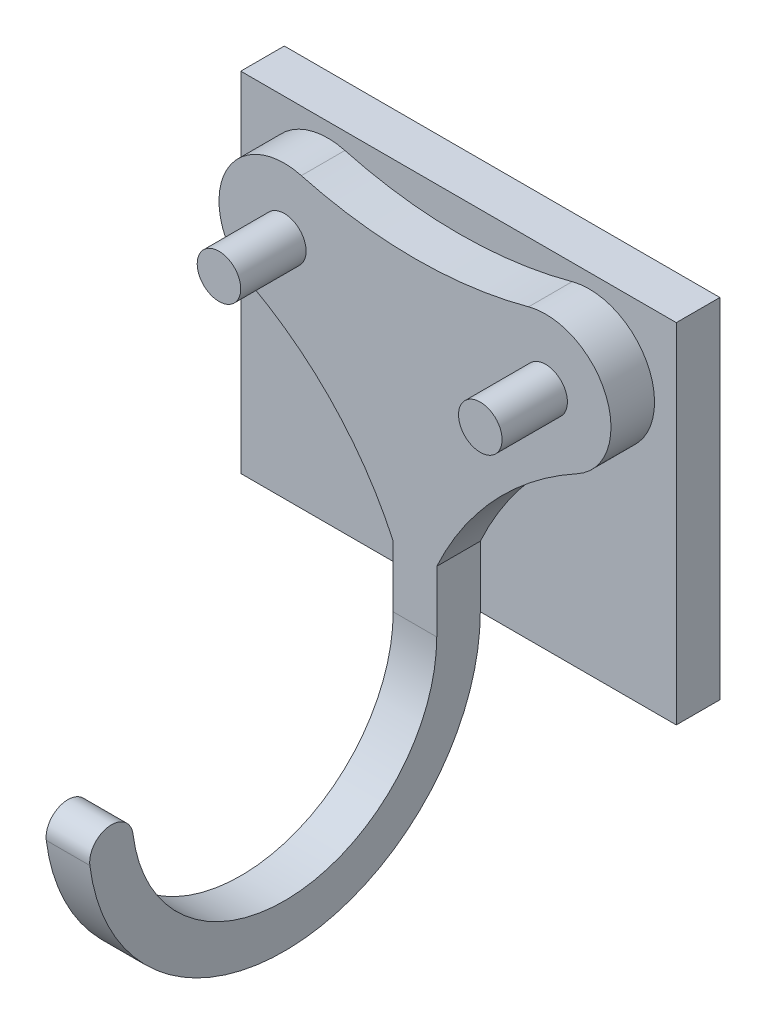
ISO-10303-21;
HEADER;
FILE_DESCRIPTION(('STEP AP214'),'2;1');
FILE_NAME('part.step','',(''),(''),'','','');
FILE_SCHEMA(('AUTOMOTIVE_DESIGN { 1 0 10303 214 1 1 1 1 }'));
ENDSEC;
DATA;
#1=APPLICATION_CONTEXT('core data for automotive mechanical design processes');
#2=APPLICATION_PROTOCOL_DEFINITION('international standard','automotive_design',2000,#1);
#3=PRODUCT_CONTEXT('',#1,'mechanical');
#4=PRODUCT('Part','Part','',(#3));
#5=PRODUCT_RELATED_PRODUCT_CATEGORY('part','',(#4));
#6=PRODUCT_DEFINITION_FORMATION('','',#4);
#7=PRODUCT_DEFINITION_CONTEXT('part definition',#1,'design');
#8=PRODUCT_DEFINITION('design','',#6,#7);
#9=PRODUCT_DEFINITION_SHAPE('','',#8);
#10=(LENGTH_UNIT() NAMED_UNIT(*) SI_UNIT(.MILLI.,.METRE.));
#11=(NAMED_UNIT(*) PLANE_ANGLE_UNIT() SI_UNIT($,.RADIAN.));
#12=(NAMED_UNIT(*) SI_UNIT($,.STERADIAN.) SOLID_ANGLE_UNIT());
#13=UNCERTAINTY_MEASURE_WITH_UNIT(LENGTH_MEASURE(1.E-05),#10,'distance_accuracy_value','');
#14=(GEOMETRIC_REPRESENTATION_CONTEXT(3) GLOBAL_UNCERTAINTY_ASSIGNED_CONTEXT((#13)) GLOBAL_UNIT_ASSIGNED_CONTEXT((#10,
#11,#12)) REPRESENTATION_CONTEXT('',''));
#15=CARTESIAN_POINT('',(0.,0.,0.));
#16=DIRECTION('',(0.,0.,1.));
#17=DIRECTION('',(1.,0.,0.));
#18=AXIS2_PLACEMENT_3D('',#15,#16,#17);
#19=CARTESIAN_POINT('',(1.2,-9.125,19.929410674843));
#20=CARTESIAN_POINT('',(1.13333333333327,-9.125,19.929410674843));
#21=CARTESIAN_POINT('',(1.06666666666676,-9.125,19.929410674843));
#22=CARTESIAN_POINT('',(0.33333333333245,-9.125,19.929410674843));
#23=CARTESIAN_POINT('',(-0.333333333333171,-9.125,19.929410674843));
#24=CARTESIAN_POINT('',(-1.06666666666668,-9.125,19.929410674843));
#25=CARTESIAN_POINT('',(-1.13333333333332,-9.125,19.929410674843));
#26=CARTESIAN_POINT('',(-1.2,-9.125,19.929410674843));
#27=CARTESIAN_POINT('',(1.2,-8.46356217223385,20.0127440081763));
#28=CARTESIAN_POINT('',(1.13333333333331,-8.46356217223385,20.0127440081763));
#29=CARTESIAN_POINT('',(1.0666666666667,-8.46356217223385,20.0127440081763));
#30=CARTESIAN_POINT('',(0.333333333333028,-8.46356217223385,20.0127440081763));
#31=CARTESIAN_POINT('',(-0.333333333333171,-8.46356217223385,20.0127440081763));
#32=CARTESIAN_POINT('',(-1.06666666666668,-8.46356217223385,20.0127440081763));
#33=CARTESIAN_POINT('',(-1.13333333333332,-8.46356217223385,20.0127440081763));
#34=CARTESIAN_POINT('',(-1.2,-8.46356217223385,20.0127440081763));
#35=CARTESIAN_POINT('',(1.2,-7.57426488752616,19.6208323040184));
#36=CARTESIAN_POINT('',(1.13333333333337,-7.57426488752616,19.6208323040184));
#37=CARTESIAN_POINT('',(1.06666666666662,-7.57426488752605,19.6208323040184));
#38=CARTESIAN_POINT('',(0.333333333333823,-7.57426488752732,19.6208323040184));
#39=CARTESIAN_POINT('',(-0.333333333333171,-7.57426488752616,19.6208323040184));
#40=CARTESIAN_POINT('',(-1.06666666666668,-7.57426488752616,19.6208323040184));
#41=CARTESIAN_POINT('',(-1.13333333333332,-7.57426488752616,19.6208323040184));
#42=CARTESIAN_POINT('',(-1.2,-7.57426488752616,19.6208323040184));
#43=CARTESIAN_POINT('',(1.2,-7.44926488752616,18.6286755623692));
#44=CARTESIAN_POINT('',(1.13333333333338,-7.44926488752616,18.6286755623692));
#45=CARTESIAN_POINT('',(1.06666666666661,-7.44926488752605,18.6286755623692));
#46=CARTESIAN_POINT('',(0.333333333333895,-7.44926488752732,18.6286755623692));
#47=CARTESIAN_POINT('',(-0.333333333333171,-7.44926488752616,18.6286755623692));
#48=CARTESIAN_POINT('',(-1.06666666666668,-7.44926488752616,18.6286755623692));
#49=CARTESIAN_POINT('',(-1.13333333333332,-7.44926488752616,18.6286755623692));
#50=CARTESIAN_POINT('',(-1.2,-7.44926488752616,18.6286755623692));
#51=CARTESIAN_POINT('',(1.2,-8.21356217223385,18.0284305248779));
#52=CARTESIAN_POINT('',(1.13333333333333,-8.21356217223385,18.0284305248779));
#53=CARTESIAN_POINT('',(1.06666666666668,-8.21356217223385,18.0284305248778));
#54=CARTESIAN_POINT('',(0.333333333333245,-8.21356217223385,18.028430524879));
#55=CARTESIAN_POINT('',(-0.333333333333171,-8.21356217223385,18.0284305248779));
#56=CARTESIAN_POINT('',(-1.06666666666668,-8.21356217223385,18.0284305248779));
#57=CARTESIAN_POINT('',(-1.13333333333332,-8.21356217223385,18.0284305248779));
#58=CARTESIAN_POINT('',(-1.2,-8.21356217223385,18.0284305248779));
#59=CARTESIAN_POINT('',(1.2,-8.875,17.9450971915445));
#60=CARTESIAN_POINT('',(1.13333333333328,-8.875,17.9450971915445));
#61=CARTESIAN_POINT('',(1.06666666666673,-8.875,17.9450971915445));
#62=CARTESIAN_POINT('',(0.333333333332666,-8.875,17.9450971915445));
#63=CARTESIAN_POINT('',(-0.333333333333171,-8.875,17.9450971915445));
#64=CARTESIAN_POINT('',(-1.06666666666668,-8.875,17.9450971915445));
#65=CARTESIAN_POINT('',(-1.13333333333332,-8.875,17.9450971915445));
#66=CARTESIAN_POINT('',(-1.2,-8.875,17.9450971915445));
#67=(BOUNDED_SURFACE() B_SPLINE_SURFACE(5,3,((#19,#20,#21,#22,#23,#24,#25,#26),(#27,#28,#29,#30,
#31,#32,#33,#34),(#35,#36,#37,#38,#39,#40,#41,#42),(#43,#44,#45,#46,#47,#48,#49,#50),(#51,#52,
#53,#54,#55,#56,#57,#58),(#59,#60,#61,#62,#63,#64,#65,#66)),.UNSPECIFIED.,.F.,.F.,
.F.) B_SPLINE_SURFACE_WITH_KNOTS((6,6),(4,2,2,4),(0.,1.),(-0.1,0.,1.,1.1),
.UNSPECIFIED.) GEOMETRIC_REPRESENTATION_ITEM() RATIONAL_B_SPLINE_SURFACE(((1.,1.,1.,1.,1.,1.,1.,
1.),(0.599999999999999,0.599999999999999,0.599999999999999,0.599999999999999,0.599999999999999,
0.599999999999999,0.599999999999999,0.599999999999999),(0.399999999999999,0.399999999999999,
0.399999999999999,0.399999999999999,0.399999999999999,0.399999999999999,0.399999999999999,
0.399999999999999),(0.399999999999999,0.399999999999999,0.399999999999999,0.399999999999999,
0.399999999999999,0.399999999999999,0.399999999999999,0.399999999999999),(0.599999999999999,
0.599999999999999,0.599999999999999,0.599999999999999,0.599999999999999,0.599999999999999,
0.599999999999999,0.599999999999999),(1.,1.,1.,1.,1.,1.,1.,1.))) REPRESENTATION_ITEM('') SURFACE());
#68=CARTESIAN_POINT('',(-1.2,-9.125,19.929410674843));
#69=CARTESIAN_POINT('',(-1.13333333333332,-9.125,19.929410674843));
#70=CARTESIAN_POINT('',(-1.06666666666668,-9.125,19.929410674843));
#71=CARTESIAN_POINT('',(-0.333333333333171,-9.125,19.929410674843));
#72=CARTESIAN_POINT('',(0.33333333333245,-9.125,19.929410674843));
#73=CARTESIAN_POINT('',(1.06666666666676,-9.125,19.929410674843));
#74=CARTESIAN_POINT('',(1.13333333333327,-9.125,19.929410674843));
#75=CARTESIAN_POINT('',(1.2,-9.125,19.929410674843));
#76=(BOUNDED_CURVE() B_SPLINE_CURVE(3,(#68,#69,#70,#71,#72,#73,#74,#75),.UNSPECIFIED.,.F.,
.F.) B_SPLINE_CURVE_WITH_KNOTS((4,2,2,4),(-0.1,0.,1.,1.1),
.UNSPECIFIED.) CURVE() GEOMETRIC_REPRESENTATION_ITEM() RATIONAL_B_SPLINE_CURVE((1.,1.,1.,1.,1.,
1.,1.,1.)) REPRESENTATION_ITEM(''));
#77=CARTESIAN_POINT('',(1.,-9.125,19.929410674843));
#78=VERTEX_POINT('',#77);
#79=CARTESIAN_POINT('',(-1.,-9.125,19.929410674843));
#80=VERTEX_POINT('',#79);
#81=EDGE_CURVE('E204',#78,#80,#76,.F.);
#82=CARTESIAN_POINT('',(1.,-9.125,19.929410674843));
#83=CARTESIAN_POINT('',(1.,-8.46356217223385,20.0127440081763));
#84=CARTESIAN_POINT('',(1.,-7.57426488752616,19.6208323040184));
#85=CARTESIAN_POINT('',(1.,-7.44926488752616,18.6286755623692));
#86=CARTESIAN_POINT('',(1.,-8.21356217223385,18.0284305248779));
#87=CARTESIAN_POINT('',(1.,-8.875,17.9450971915445));
#88=(BOUNDED_CURVE() B_SPLINE_CURVE(5,(#82,#83,#84,#85,#86,#87),.UNSPECIFIED.,.F.,
.F.) B_SPLINE_CURVE_WITH_KNOTS((6,6),(0.,1.),
.UNSPECIFIED.) CURVE() GEOMETRIC_REPRESENTATION_ITEM() RATIONAL_B_SPLINE_CURVE((1.,
0.599999999999999,0.399999999999999,0.399999999999999,0.599999999999999,1.)) REPRESENTATION_ITEM(''));
#89=CARTESIAN_POINT('',(1.,-8.875,17.9450971915445));
#90=VERTEX_POINT('',#89);
#91=EDGE_CURVE('E53',#90,#78,#88,.F.);
#92=CARTESIAN_POINT('',(1.2,-8.875,17.9450971915445));
#93=CARTESIAN_POINT('',(1.13333333333328,-8.875,17.9450971915445));
#94=CARTESIAN_POINT('',(1.06666666666673,-8.875,17.9450971915445));
#95=CARTESIAN_POINT('',(0.333333333332666,-8.875,17.9450971915445));
#96=CARTESIAN_POINT('',(-0.333333333333171,-8.875,17.9450971915445));
#97=CARTESIAN_POINT('',(-1.06666666666668,-8.875,17.9450971915445));
#98=CARTESIAN_POINT('',(-1.13333333333332,-8.875,17.9450971915445));
#99=CARTESIAN_POINT('',(-1.2,-8.875,17.9450971915445));
#100=(BOUNDED_CURVE() B_SPLINE_CURVE(3,(#92,#93,#94,#95,#96,#97,#98,#99),.UNSPECIFIED.,.F.,
.F.) B_SPLINE_CURVE_WITH_KNOTS((4,2,2,4),(-0.1,0.,1.,1.1),
.UNSPECIFIED.) CURVE() GEOMETRIC_REPRESENTATION_ITEM() RATIONAL_B_SPLINE_CURVE((1.,1.,1.,1.,1.,
1.,1.,1.)) REPRESENTATION_ITEM(''));
#101=CARTESIAN_POINT('',(-1.,-8.875,17.9450971915445));
#102=VERTEX_POINT('',#101);
#103=EDGE_CURVE('E362',#102,#90,#100,.F.);
#104=CARTESIAN_POINT('',(-1.,-8.875,17.9450971915445));
#105=CARTESIAN_POINT('',(-1.,-8.21356217223385,18.0284305248779));
#106=CARTESIAN_POINT('',(-1.,-7.44926488752616,18.6286755623692));
#107=CARTESIAN_POINT('',(-1.,-7.57426488752616,19.6208323040184));
#108=CARTESIAN_POINT('',(-1.,-8.46356217223385,20.0127440081763));
#109=CARTESIAN_POINT('',(-1.,-9.125,19.929410674843));
#110=(BOUNDED_CURVE() B_SPLINE_CURVE(5,(#104,#105,#106,#107,#108,#109),.UNSPECIFIED.,.F.,
.F.) B_SPLINE_CURVE_WITH_KNOTS((6,6),(0.,1.),
.UNSPECIFIED.) CURVE() GEOMETRIC_REPRESENTATION_ITEM() RATIONAL_B_SPLINE_CURVE((1.,
0.599999999999999,0.399999999999999,0.399999999999999,0.599999999999999,1.)) REPRESENTATION_ITEM(''));
#111=EDGE_CURVE('E62',#80,#102,#110,.F.);
#112=ORIENTED_EDGE('',*,*,#81,.F.);
#113=ORIENTED_EDGE('',*,*,#91,.F.);
#114=ORIENTED_EDGE('',*,*,#103,.F.);
#115=ORIENTED_EDGE('',*,*,#111,.F.);
#116=EDGE_LOOP('',(#112,#113,#114,#115));
#117=FACE_BOUND('',#116,.T.);
#118=ADVANCED_FACE('F35',(#117),#67,.T.);
#119=CARTESIAN_POINT('',(-10.,-8.,2.));
#120=DIRECTION('',(0.,1.,0.));
#121=DIRECTION('',(0.,0.,1.));
#122=AXIS2_PLACEMENT_3D('',#119,#120,#121);
#123=PLANE('',#122);
#124=DIRECTION('',(-1.,0.,0.));
#125=VECTOR('',#124,1.);
#126=CARTESIAN_POINT('',(1.,-8.,2.));
#127=LINE('',#126,#125);
#128=CARTESIAN_POINT('',(1.,-8.,2.));
#129=VERTEX_POINT('',#128);
#130=CARTESIAN_POINT('',(-1.,-8.,2.));
#131=VERTEX_POINT('',#130);
#132=EDGE_CURVE('E153',#129,#131,#127,.T.);
#133=ORIENTED_EDGE('',*,*,#132,.T.);
#134=DIRECTION('',(1.,0.,0.));
#135=VECTOR('',#134,1.);
#136=CARTESIAN_POINT('',(-10.,-8.,2.));
#137=LINE('',#136,#135);
#138=CARTESIAN_POINT('',(-10.,-8.,2.));
#139=VERTEX_POINT('',#138);
#140=EDGE_CURVE('E176',#139,#131,#137,.T.);
#141=ORIENTED_EDGE('',*,*,#140,.F.);
#142=DIRECTION('',(0.,0.,-1.));
#143=VECTOR('',#142,1.);
#144=CARTESIAN_POINT('',(-10.,-8.,2.));
#145=LINE('',#144,#143);
#146=CARTESIAN_POINT('',(-10.,-8.,0.));
#147=VERTEX_POINT('',#146);
#148=EDGE_CURVE('E195',#139,#147,#145,.T.);
#149=ORIENTED_EDGE('',*,*,#148,.T.);
#150=DIRECTION('',(1.,0.,0.));
#151=VECTOR('',#150,1.);
#152=CARTESIAN_POINT('',(-10.,-8.,0.));
#153=LINE('',#152,#151);
#154=CARTESIAN_POINT('',(10.,-8.,0.));
#155=VERTEX_POINT('',#154);
#156=EDGE_CURVE('E191',#147,#155,#153,.T.);
#157=ORIENTED_EDGE('',*,*,#156,.T.);
#158=DIRECTION('',(0.,0.,-1.));
#159=VECTOR('',#158,1.);
#160=CARTESIAN_POINT('',(10.,-8.,2.));
#161=LINE('',#160,#159);
#162=CARTESIAN_POINT('',(10.,-8.,2.));
#163=VERTEX_POINT('',#162);
#164=EDGE_CURVE('E174',#163,#155,#161,.T.);
#165=ORIENTED_EDGE('',*,*,#164,.F.);
#166=EDGE_CURVE('E167',#129,#163,#137,.T.);
#167=ORIENTED_EDGE('',*,*,#166,.F.);
#168=EDGE_LOOP('',(#133,#141,#149,#157,#165,#167));
#169=FACE_BOUND('',#168,.T.);
#170=ADVANCED_FACE('F172',(#169),#123,.F.);
#171=CARTESIAN_POINT('',(10.,8.,2.));
#172=DIRECTION('',(-1.,0.,0.));
#173=DIRECTION('',(0.,0.,1.));
#174=AXIS2_PLACEMENT_3D('',#171,#172,#173);
#175=PLANE('',#174);
#176=DIRECTION('',(0.,1.,0.));
#177=VECTOR('',#176,1.);
#178=CARTESIAN_POINT('',(10.,8.,0.));
#179=LINE('',#178,#177);
#180=CARTESIAN_POINT('',(10.,8.,0.));
#181=VERTEX_POINT('',#180);
#182=EDGE_CURVE('E183',#155,#181,#179,.T.);
#183=ORIENTED_EDGE('',*,*,#182,.T.);
#184=DIRECTION('',(0.,0.,-1.));
#185=VECTOR('',#184,1.);
#186=CARTESIAN_POINT('',(10.,8.,2.));
#187=LINE('',#186,#185);
#188=CARTESIAN_POINT('',(10.,8.,2.));
#189=VERTEX_POINT('',#188);
#190=EDGE_CURVE('E201',#189,#181,#187,.T.);
#191=ORIENTED_EDGE('',*,*,#190,.F.);
#192=DIRECTION('',(0.,1.,0.));
#193=VECTOR('',#192,1.);
#194=CARTESIAN_POINT('',(10.,8.,2.));
#195=LINE('',#194,#193);
#196=EDGE_CURVE('E193',#163,#189,#195,.T.);
#197=ORIENTED_EDGE('',*,*,#196,.F.);
#198=ORIENTED_EDGE('',*,*,#164,.T.);
#199=EDGE_LOOP('',(#183,#191,#197,#198));
#200=FACE_BOUND('',#199,.T.);
#201=ADVANCED_FACE('F434',(#200),#175,.F.);
#202=CARTESIAN_POINT('',(-10.,8.,2.));
#203=DIRECTION('',(0.,-1.,0.));
#204=DIRECTION('',(0.,0.,-1.));
#205=AXIS2_PLACEMENT_3D('',#202,#203,#204);
#206=PLANE('',#205);
#207=DIRECTION('',(-1.,0.,0.));
#208=VECTOR('',#207,1.);
#209=CARTESIAN_POINT('',(-10.,8.,0.));
#210=LINE('',#209,#208);
#211=CARTESIAN_POINT('',(-10.,8.,0.));
#212=VERTEX_POINT('',#211);
#213=EDGE_CURVE('E186',#181,#212,#210,.T.);
#214=ORIENTED_EDGE('',*,*,#213,.T.);
#215=DIRECTION('',(0.,0.,-1.));
#216=VECTOR('',#215,1.);
#217=CARTESIAN_POINT('',(-10.,8.,2.));
#218=LINE('',#217,#216);
#219=CARTESIAN_POINT('',(-10.,8.,2.));
#220=VERTEX_POINT('',#219);
#221=EDGE_CURVE('E198',#220,#212,#218,.T.);
#222=ORIENTED_EDGE('',*,*,#221,.F.);
#223=DIRECTION('',(-1.,0.,0.));
#224=VECTOR('',#223,1.);
#225=CARTESIAN_POINT('',(-10.,8.,2.));
#226=LINE('',#225,#224);
#227=EDGE_CURVE('E179',#189,#220,#226,.T.);
#228=ORIENTED_EDGE('',*,*,#227,.F.);
#229=ORIENTED_EDGE('',*,*,#190,.T.);
#230=EDGE_LOOP('',(#214,#222,#228,#229));
#231=FACE_BOUND('',#230,.T.);
#232=ADVANCED_FACE('F268',(#231),#206,.F.);
#233=CARTESIAN_POINT('',(-10.,8.,2.));
#234=DIRECTION('',(1.,0.,0.));
#235=DIRECTION('',(0.,0.,-1.));
#236=AXIS2_PLACEMENT_3D('',#233,#234,#235);
#237=PLANE('',#236);
#238=DIRECTION('',(0.,-1.,0.));
#239=VECTOR('',#238,1.);
#240=CARTESIAN_POINT('',(-10.,8.,0.));
#241=LINE('',#240,#239);
#242=EDGE_CURVE('E189',#212,#147,#241,.T.);
#243=ORIENTED_EDGE('',*,*,#242,.T.);
#244=ORIENTED_EDGE('',*,*,#148,.F.);
#245=DIRECTION('',(0.,-1.,0.));
#246=VECTOR('',#245,1.);
#247=CARTESIAN_POINT('',(-10.,8.,2.));
#248=LINE('',#247,#246);
#249=EDGE_CURVE('E177',#220,#139,#248,.T.);
#250=ORIENTED_EDGE('',*,*,#249,.F.);
#251=ORIENTED_EDGE('',*,*,#221,.T.);
#252=EDGE_LOOP('',(#243,#244,#250,#251));
#253=FACE_BOUND('',#252,.T.);
#254=ADVANCED_FACE('F271',(#253),#237,.F.);
#255=CARTESIAN_POINT('',(0.,0.,2.));
#256=DIRECTION('',(0.,0.,1.));
#257=DIRECTION('',(1.,0.,0.));
#258=AXIS2_PLACEMENT_3D('',#255,#256,#257);
#259=PLANE('',#258);
#260=DIRECTION('',(0.,-1.,0.));
#261=VECTOR('',#260,1.);
#262=CARTESIAN_POINT('',(-1.,-8.,2.));
#263=LINE('',#262,#261);
#264=CARTESIAN_POINT('',(-1.,-5.19120215029254,2.));
#265=VERTEX_POINT('',#264);
#266=EDGE_CURVE('E217',#265,#131,#263,.T.);
#267=ORIENTED_EDGE('',*,*,#266,.F.);
#268=CARTESIAN_POINT('',(-14.6287974311861,-11.4566534971387,2.));
#269=DIRECTION('',(0.,0.,-1.));
#270=DIRECTION('',(1.,0.,0.));
#271=AXIS2_PLACEMENT_3D('',#268,#269,#270);
#272=CIRCLE('',#271,15.);
#273=CARTESIAN_POINT('',(-7.43813290519768,1.7074774530871,2.));
#274=VERTEX_POINT('',#273);
#275=EDGE_CURVE('E243',#274,#265,#272,.T.);
#276=ORIENTED_EDGE('',*,*,#275,.F.);
#277=CARTESIAN_POINT('',(-6.,4.34030364313225,2.));
#278=DIRECTION('',(0.,0.,1.));
#279=DIRECTION('',(1.,0.,0.));
#280=AXIS2_PLACEMENT_3D('',#277,#278,#279);
#281=CIRCLE('',#280,3.);
#282=CARTESIAN_POINT('',(-5.21739130434783,7.23642581415502,2.));
#283=VERTEX_POINT('',#282);
#284=EDGE_CURVE('E240',#283,#274,#281,.T.);
#285=ORIENTED_EDGE('',*,*,#284,.F.);
#286=CARTESIAN_POINT('',(0.,26.5439069543068,2.));
#287=DIRECTION('',(0.,0.,-1.));
#288=DIRECTION('',(1.,0.,0.));
#289=AXIS2_PLACEMENT_3D('',#286,#287,#288);
#290=CIRCLE('',#289,20.);
#291=CARTESIAN_POINT('',(5.21739130434782,7.23642581415501,2.));
#292=VERTEX_POINT('',#291);
#293=EDGE_CURVE('E237',#292,#283,#290,.T.);
#294=ORIENTED_EDGE('',*,*,#293,.F.);
#295=CARTESIAN_POINT('',(6.,4.34030364313226,2.));
#296=DIRECTION('',(0.,0.,1.));
#297=DIRECTION('',(1.,0.,0.));
#298=AXIS2_PLACEMENT_3D('',#295,#296,#297);
#299=CIRCLE('',#298,3.);
#300=CARTESIAN_POINT('',(7.43813290519768,1.7074774530871,2.));
#301=VERTEX_POINT('',#300);
#302=EDGE_CURVE('E234',#301,#292,#299,.T.);
#303=ORIENTED_EDGE('',*,*,#302,.F.);
#304=CARTESIAN_POINT('',(14.6287974311861,-11.4566534971387,2.));
#305=DIRECTION('',(0.,0.,-1.));
#306=DIRECTION('',(-1.,0.,0.));
#307=AXIS2_PLACEMENT_3D('',#304,#305,#306);
#308=CIRCLE('',#307,15.);
#309=CARTESIAN_POINT('',(0.999999999999999,-5.19120215029254,2.));
#310=VERTEX_POINT('',#309);
#311=EDGE_CURVE('E170',#310,#301,#308,.T.);
#312=ORIENTED_EDGE('',*,*,#311,.F.);
#313=DIRECTION('',(0.,1.,0.));
#314=VECTOR('',#313,1.);
#315=CARTESIAN_POINT('',(1.,-8.,2.));
#316=LINE('',#315,#314);
#317=EDGE_CURVE('E148',#129,#310,#316,.T.);
#318=ORIENTED_EDGE('',*,*,#317,.F.);
#319=ORIENTED_EDGE('',*,*,#166,.T.);
#320=ORIENTED_EDGE('',*,*,#196,.T.);
#321=ORIENTED_EDGE('',*,*,#227,.T.);
#322=ORIENTED_EDGE('',*,*,#249,.T.);
#323=ORIENTED_EDGE('',*,*,#140,.T.);
#324=EDGE_LOOP('',(#267,#276,#285,#294,#303,#312,#318,#319,#320,#321,#322,#323));
#325=FACE_BOUND('',#324,.T.);
#326=ADVANCED_FACE('F165',(#325),#259,.T.);
#327=CARTESIAN_POINT('',(0.,0.,0.));
#328=DIRECTION('',(0.,0.,1.));
#329=DIRECTION('',(1.,0.,0.));
#330=AXIS2_PLACEMENT_3D('',#327,#328,#329);
#331=PLANE('',#330);
#332=ORIENTED_EDGE('',*,*,#182,.F.);
#333=ORIENTED_EDGE('',*,*,#156,.F.);
#334=ORIENTED_EDGE('',*,*,#242,.F.);
#335=ORIENTED_EDGE('',*,*,#213,.F.);
#336=EDGE_LOOP('',(#332,#333,#334,#335));
#337=FACE_BOUND('',#336,.T.);
#338=ADVANCED_FACE('F398',(#337),#331,.F.);
#339=CARTESIAN_POINT('',(1.,-8.,4.));
#340=DIRECTION('',(-1.,0.,0.));
#341=DIRECTION('',(0.,0.,1.));
#342=AXIS2_PLACEMENT_3D('',#339,#340,#341);
#343=PLANE('',#342);
#344=CARTESIAN_POINT('',(1.,-8.,11.));
#345=DIRECTION('',(-1.,0.,0.));
#346=DIRECTION('',(0.,0.,1.));
#347=AXIS2_PLACEMENT_3D('',#344,#345,#346);
#348=CIRCLE('',#347,7.);
#349=CARTESIAN_POINT('',(1.,-8.,4.));
#350=VERTEX_POINT('',#349);
#351=EDGE_CURVE('E154',#350,#90,#348,.T.);
#352=ORIENTED_EDGE('',*,*,#351,.T.);
#353=ORIENTED_EDGE('',*,*,#91,.T.);
#354=CARTESIAN_POINT('',(1.,-8.,11.));
#355=DIRECTION('',(1.,0.,0.));
#356=DIRECTION('',(0.,0.,1.));
#357=AXIS2_PLACEMENT_3D('',#354,#355,#356);
#358=CIRCLE('',#357,9.);
#359=EDGE_CURVE('E142',#78,#129,#358,.T.);
#360=ORIENTED_EDGE('',*,*,#359,.T.);
#361=ORIENTED_EDGE('',*,*,#317,.T.);
#362=DIRECTION('',(0.,0.,-1.));
#363=VECTOR('',#362,1.);
#364=CARTESIAN_POINT('',(0.999999999999999,-5.19120215029254,4.));
#365=LINE('',#364,#363);
#366=CARTESIAN_POINT('',(0.999999999999999,-5.19120215029254,4.));
#367=VERTEX_POINT('',#366);
#368=EDGE_CURVE('E187',#367,#310,#365,.T.);
#369=ORIENTED_EDGE('',*,*,#368,.F.);
#370=DIRECTION('',(0.,1.,0.));
#371=VECTOR('',#370,1.);
#372=CARTESIAN_POINT('',(1.,-8.,4.));
#373=LINE('',#372,#371);
#374=EDGE_CURVE('E216',#350,#367,#373,.T.);
#375=ORIENTED_EDGE('',*,*,#374,.F.);
#376=EDGE_LOOP('',(#352,#353,#360,#361,#369,#375));
#377=FACE_BOUND('',#376,.T.);
#378=ADVANCED_FACE('F145',(#377),#343,.F.);
#379=CARTESIAN_POINT('',(14.6287974311861,-11.4566534971387,4.));
#380=DIRECTION('',(0.,0.,-1.));
#381=DIRECTION('',(-1.,0.,0.));
#382=AXIS2_PLACEMENT_3D('',#379,#380,#381);
#383=CYLINDRICAL_SURFACE('',#382,15.);
#384=ORIENTED_EDGE('',*,*,#311,.T.);
#385=DIRECTION('',(0.,0.,-1.));
#386=VECTOR('',#385,1.);
#387=CARTESIAN_POINT('',(7.43813290519768,1.7074774530871,4.));
#388=LINE('',#387,#386);
#389=CARTESIAN_POINT('',(7.43813290519768,1.7074774530871,4.));
#390=VERTEX_POINT('',#389);
#391=EDGE_CURVE('E259',#390,#301,#388,.T.);
#392=ORIENTED_EDGE('',*,*,#391,.F.);
#393=CARTESIAN_POINT('',(14.6287974311861,-11.4566534971387,4.));
#394=DIRECTION('',(0.,0.,-1.));
#395=DIRECTION('',(-1.,0.,0.));
#396=AXIS2_PLACEMENT_3D('',#393,#394,#395);
#397=CIRCLE('',#396,15.);
#398=EDGE_CURVE('E219',#367,#390,#397,.T.);
#399=ORIENTED_EDGE('',*,*,#398,.F.);
#400=ORIENTED_EDGE('',*,*,#368,.T.);
#401=EDGE_LOOP('',(#384,#392,#399,#400));
#402=FACE_BOUND('',#401,.T.);
#403=ADVANCED_FACE('F294',(#402),#383,.F.);
#404=CARTESIAN_POINT('',(6.,4.34030364313226,4.));
#405=DIRECTION('',(0.,0.,-1.));
#406=DIRECTION('',(-1.,0.,0.));
#407=AXIS2_PLACEMENT_3D('',#404,#405,#406);
#408=CYLINDRICAL_SURFACE('',#407,3.);
#409=ORIENTED_EDGE('',*,*,#302,.T.);
#410=DIRECTION('',(0.,0.,-1.));
#411=VECTOR('',#410,1.);
#412=CARTESIAN_POINT('',(5.21739130434782,7.23642581415501,4.));
#413=LINE('',#412,#411);
#414=CARTESIAN_POINT('',(5.21739130434782,7.23642581415501,4.));
#415=VERTEX_POINT('',#414);
#416=EDGE_CURVE('E256',#415,#292,#413,.T.);
#417=ORIENTED_EDGE('',*,*,#416,.F.);
#418=CARTESIAN_POINT('',(6.,4.34030364313226,4.));
#419=DIRECTION('',(0.,0.,1.));
#420=DIRECTION('',(1.,0.,0.));
#421=AXIS2_PLACEMENT_3D('',#418,#419,#420);
#422=CIRCLE('',#421,3.);
#423=EDGE_CURVE('E221',#390,#415,#422,.T.);
#424=ORIENTED_EDGE('',*,*,#423,.F.);
#425=ORIENTED_EDGE('',*,*,#391,.T.);
#426=EDGE_LOOP('',(#409,#417,#424,#425));
#427=FACE_BOUND('',#426,.T.);
#428=ADVANCED_FACE('F289',(#427),#408,.T.);
#429=CARTESIAN_POINT('',(0.,26.5439069543068,4.));
#430=DIRECTION('',(0.,0.,-1.));
#431=DIRECTION('',(-1.,0.,0.));
#432=AXIS2_PLACEMENT_3D('',#429,#430,#431);
#433=CYLINDRICAL_SURFACE('',#432,20.);
#434=ORIENTED_EDGE('',*,*,#293,.T.);
#435=DIRECTION('',(0.,0.,-1.));
#436=VECTOR('',#435,1.);
#437=CARTESIAN_POINT('',(-5.21739130434783,7.23642581415502,4.));
#438=LINE('',#437,#436);
#439=CARTESIAN_POINT('',(-5.21739130434783,7.23642581415502,4.));
#440=VERTEX_POINT('',#439);
#441=EDGE_CURVE('E253',#440,#283,#438,.T.);
#442=ORIENTED_EDGE('',*,*,#441,.F.);
#443=CARTESIAN_POINT('',(0.,26.5439069543068,4.));
#444=DIRECTION('',(0.,0.,-1.));
#445=DIRECTION('',(1.,0.,0.));
#446=AXIS2_PLACEMENT_3D('',#443,#444,#445);
#447=CIRCLE('',#446,20.);
#448=EDGE_CURVE('E223',#415,#440,#447,.T.);
#449=ORIENTED_EDGE('',*,*,#448,.F.);
#450=ORIENTED_EDGE('',*,*,#416,.T.);
#451=EDGE_LOOP('',(#434,#442,#449,#450));
#452=FACE_BOUND('',#451,.T.);
#453=ADVANCED_FACE('F286',(#452),#433,.F.);
#454=CARTESIAN_POINT('',(-6.,4.34030364313225,4.));
#455=DIRECTION('',(0.,0.,-1.));
#456=DIRECTION('',(-1.,0.,0.));
#457=AXIS2_PLACEMENT_3D('',#454,#455,#456);
#458=CYLINDRICAL_SURFACE('',#457,3.);
#459=ORIENTED_EDGE('',*,*,#284,.T.);
#460=DIRECTION('',(0.,0.,-1.));
#461=VECTOR('',#460,1.);
#462=CARTESIAN_POINT('',(-7.43813290519768,1.7074774530871,4.));
#463=LINE('',#462,#461);
#464=CARTESIAN_POINT('',(-7.43813290519768,1.7074774530871,4.));
#465=VERTEX_POINT('',#464);
#466=EDGE_CURVE('E250',#465,#274,#463,.T.);
#467=ORIENTED_EDGE('',*,*,#466,.F.);
#468=CARTESIAN_POINT('',(-6.,4.34030364313225,4.));
#469=DIRECTION('',(0.,0.,1.));
#470=DIRECTION('',(1.,0.,0.));
#471=AXIS2_PLACEMENT_3D('',#468,#469,#470);
#472=CIRCLE('',#471,3.);
#473=EDGE_CURVE('E225',#440,#465,#472,.T.);
#474=ORIENTED_EDGE('',*,*,#473,.F.);
#475=ORIENTED_EDGE('',*,*,#441,.T.);
#476=EDGE_LOOP('',(#459,#467,#474,#475));
#477=FACE_BOUND('',#476,.T.);
#478=ADVANCED_FACE('F281',(#477),#458,.T.);
#479=CARTESIAN_POINT('',(-14.6287974311861,-11.4566534971387,4.));
#480=DIRECTION('',(0.,0.,-1.));
#481=DIRECTION('',(-1.,0.,0.));
#482=AXIS2_PLACEMENT_3D('',#479,#480,#481);
#483=CYLINDRICAL_SURFACE('',#482,15.);
#484=ORIENTED_EDGE('',*,*,#275,.T.);
#485=DIRECTION('',(0.,0.,-1.));
#486=VECTOR('',#485,1.);
#487=CARTESIAN_POINT('',(-1.,-5.19120215029254,4.));
#488=LINE('',#487,#486);
#489=CARTESIAN_POINT('',(-1.,-5.19120215029254,4.));
#490=VERTEX_POINT('',#489);
#491=EDGE_CURVE('E231',#490,#265,#488,.T.);
#492=ORIENTED_EDGE('',*,*,#491,.F.);
#493=CARTESIAN_POINT('',(-14.6287974311861,-11.4566534971387,4.));
#494=DIRECTION('',(0.,0.,-1.));
#495=DIRECTION('',(1.,0.,0.));
#496=AXIS2_PLACEMENT_3D('',#493,#494,#495);
#497=CIRCLE('',#496,15.);
#498=EDGE_CURVE('E227',#465,#490,#497,.T.);
#499=ORIENTED_EDGE('',*,*,#498,.F.);
#500=ORIENTED_EDGE('',*,*,#466,.T.);
#501=EDGE_LOOP('',(#484,#492,#499,#500));
#502=FACE_BOUND('',#501,.T.);
#503=ADVANCED_FACE('F278',(#502),#483,.F.);
#504=CARTESIAN_POINT('',(-1.,-8.,4.));
#505=DIRECTION('',(1.,0.,0.));
#506=DIRECTION('',(0.,0.,-1.));
#507=AXIS2_PLACEMENT_3D('',#504,#505,#506);
#508=PLANE('',#507);
#509=CARTESIAN_POINT('',(-1.,-8.,11.));
#510=DIRECTION('',(1.,0.,0.));
#511=DIRECTION('',(0.,0.,1.));
#512=AXIS2_PLACEMENT_3D('',#509,#510,#511);
#513=CIRCLE('',#512,9.);
#514=EDGE_CURVE('E158',#80,#131,#513,.T.);
#515=ORIENTED_EDGE('',*,*,#514,.F.);
#516=ORIENTED_EDGE('',*,*,#111,.T.);
#517=CARTESIAN_POINT('',(-1.,-8.,11.));
#518=DIRECTION('',(-1.,0.,0.));
#519=DIRECTION('',(0.,0.,1.));
#520=AXIS2_PLACEMENT_3D('',#517,#518,#519);
#521=CIRCLE('',#520,7.);
#522=CARTESIAN_POINT('',(-1.,-8.,4.));
#523=VERTEX_POINT('',#522);
#524=EDGE_CURVE('E206',#523,#102,#521,.T.);
#525=ORIENTED_EDGE('',*,*,#524,.F.);
#526=DIRECTION('',(0.,-1.,0.));
#527=VECTOR('',#526,1.);
#528=CARTESIAN_POINT('',(-1.,-8.,4.));
#529=LINE('',#528,#527);
#530=EDGE_CURVE('E229',#490,#523,#529,.T.);
#531=ORIENTED_EDGE('',*,*,#530,.F.);
#532=ORIENTED_EDGE('',*,*,#491,.T.);
#533=ORIENTED_EDGE('',*,*,#266,.T.);
#534=EDGE_LOOP('',(#515,#516,#525,#531,#532,#533));
#535=FACE_BOUND('',#534,.T.);
#536=ADVANCED_FACE('F273',(#535),#508,.F.);
#537=CARTESIAN_POINT('',(14.6287974311861,-11.4566534971387,4.));
#538=DIRECTION('',(0.,0.,-1.));
#539=DIRECTION('',(-1.,0.,0.));
#540=AXIS2_PLACEMENT_3D('',#537,#538,#539);
#541=PLANE('',#540);
#542=CARTESIAN_POINT('',(6.,4.34030364313226,4.));
#543=DIRECTION('',(0.,0.,-1.));
#544=DIRECTION('',(-1.,0.,0.));
#545=AXIS2_PLACEMENT_3D('',#542,#543,#544);
#546=CIRCLE('',#545,1.);
#547=CARTESIAN_POINT('',(5.,4.34030364313226,4.));
#548=VERTEX_POINT('',#547);
#549=EDGE_CURVE('E11',#548,#548,#546,.F.);
#550=ORIENTED_EDGE('',*,*,#549,.F.);
#551=EDGE_LOOP('',(#550));
#552=FACE_BOUND('',#551,.T.);
#553=CARTESIAN_POINT('',(-6.,4.34030364313225,4.));
#554=DIRECTION('',(0.,0.,-1.));
#555=DIRECTION('',(-1.,0.,0.));
#556=AXIS2_PLACEMENT_3D('',#553,#554,#555);
#557=CIRCLE('',#556,1.);
#558=CARTESIAN_POINT('',(-7.,4.34030364313225,4.));
#559=VERTEX_POINT('',#558);
#560=EDGE_CURVE('E46',#559,#559,#557,.F.);
#561=ORIENTED_EDGE('',*,*,#560,.F.);
#562=EDGE_LOOP('',(#561));
#563=FACE_BOUND('',#562,.T.);
#564=DIRECTION('',(1.,0.,0.));
#565=VECTOR('',#564,1.);
#566=CARTESIAN_POINT('',(-1.,-8.,4.));
#567=LINE('',#566,#565);
#568=EDGE_CURVE('E213',#523,#350,#567,.T.);
#569=ORIENTED_EDGE('',*,*,#568,.T.);
#570=ORIENTED_EDGE('',*,*,#374,.T.);
#571=ORIENTED_EDGE('',*,*,#398,.T.);
#572=ORIENTED_EDGE('',*,*,#423,.T.);
#573=ORIENTED_EDGE('',*,*,#448,.T.);
#574=ORIENTED_EDGE('',*,*,#473,.T.);
#575=ORIENTED_EDGE('',*,*,#498,.T.);
#576=ORIENTED_EDGE('',*,*,#530,.T.);
#577=EDGE_LOOP('',(#569,#570,#571,#572,#573,#574,#575,#576));
#578=FACE_BOUND('',#577,.T.);
#579=ADVANCED_FACE('F297',(#552,#563,#578),#541,.F.);
#580=CARTESIAN_POINT('',(1.,-8.,11.));
#581=DIRECTION('',(-1.,0.,0.));
#582=DIRECTION('',(0.,0.,1.));
#583=AXIS2_PLACEMENT_3D('',#580,#581,#582);
#584=CYLINDRICAL_SURFACE('',#583,7.);
#585=ORIENTED_EDGE('',*,*,#524,.T.);
#586=ORIENTED_EDGE('',*,*,#103,.T.);
#587=ORIENTED_EDGE('',*,*,#351,.F.);
#588=ORIENTED_EDGE('',*,*,#568,.F.);
#589=EDGE_LOOP('',(#585,#586,#587,#588));
#590=FACE_BOUND('',#589,.T.);
#591=ADVANCED_FACE('F300',(#590),#584,.F.);
#592=CARTESIAN_POINT('',(1.,-8.,11.));
#593=DIRECTION('',(-1.,0.,0.));
#594=DIRECTION('',(0.,0.,1.));
#595=AXIS2_PLACEMENT_3D('',#592,#593,#594);
#596=CYLINDRICAL_SURFACE('',#595,9.);
#597=ORIENTED_EDGE('',*,*,#359,.F.);
#598=ORIENTED_EDGE('',*,*,#81,.T.);
#599=ORIENTED_EDGE('',*,*,#514,.T.);
#600=ORIENTED_EDGE('',*,*,#132,.F.);
#601=EDGE_LOOP('',(#597,#598,#599,#600));
#602=FACE_BOUND('',#601,.T.);
#603=ADVANCED_FACE('F157',(#602),#596,.T.);
#604=CARTESIAN_POINT('',(-6.,4.34030364313225,7.));
#605=DIRECTION('',(0.,0.,-1.));
#606=DIRECTION('',(-1.,0.,0.));
#607=AXIS2_PLACEMENT_3D('',#604,#605,#606);
#608=CYLINDRICAL_SURFACE('',#607,1.);
#609=CARTESIAN_POINT('',(-6.,4.34030364313225,7.));
#610=DIRECTION('',(0.,0.,1.));
#611=DIRECTION('',(1.,0.,0.));
#612=AXIS2_PLACEMENT_3D('',#609,#610,#611);
#613=CIRCLE('',#612,1.);
#614=CARTESIAN_POINT('',(-5.,4.34030364313225,7.));
#615=VERTEX_POINT('',#614);
#616=EDGE_CURVE('E301',#615,#615,#613,.T.);
#617=ORIENTED_EDGE('',*,*,#616,.F.);
#618=EDGE_LOOP('',(#617));
#619=FACE_BOUND('',#618,.T.);
#620=ORIENTED_EDGE('',*,*,#560,.T.);
#621=EDGE_LOOP('',(#620));
#622=FACE_BOUND('',#621,.T.);
#623=ADVANCED_FACE('F419',(#619,#622),#608,.T.);
#624=CARTESIAN_POINT('',(-6.,4.34030364313225,7.));
#625=DIRECTION('',(0.,0.,1.));
#626=DIRECTION('',(1.,0.,0.));
#627=AXIS2_PLACEMENT_3D('',#624,#625,#626);
#628=PLANE('',#627);
#629=ORIENTED_EDGE('',*,*,#616,.T.);
#630=EDGE_LOOP('',(#629));
#631=FACE_BOUND('',#630,.T.);
#632=ADVANCED_FACE('F325',(#631),#628,.T.);
#633=CARTESIAN_POINT('',(6.,4.34030364313226,7.));
#634=DIRECTION('',(0.,0.,-1.));
#635=DIRECTION('',(-1.,0.,0.));
#636=AXIS2_PLACEMENT_3D('',#633,#634,#635);
#637=CYLINDRICAL_SURFACE('',#636,1.);
#638=CARTESIAN_POINT('',(6.,4.34030364313226,7.));
#639=DIRECTION('',(0.,0.,1.));
#640=DIRECTION('',(1.,0.,0.));
#641=AXIS2_PLACEMENT_3D('',#638,#639,#640);
#642=CIRCLE('',#641,1.);
#643=CARTESIAN_POINT('',(7.,4.34030364313226,7.));
#644=VERTEX_POINT('',#643);
#645=EDGE_CURVE('E304',#644,#644,#642,.T.);
#646=ORIENTED_EDGE('',*,*,#645,.F.);
#647=EDGE_LOOP('',(#646));
#648=FACE_BOUND('',#647,.T.);
#649=ORIENTED_EDGE('',*,*,#549,.T.);
#650=EDGE_LOOP('',(#649));
#651=FACE_BOUND('',#650,.T.);
#652=ADVANCED_FACE('F322',(#648,#651),#637,.T.);
#653=CARTESIAN_POINT('',(6.,4.34030364313226,7.));
#654=DIRECTION('',(0.,0.,1.));
#655=DIRECTION('',(1.,0.,0.));
#656=AXIS2_PLACEMENT_3D('',#653,#654,#655);
#657=PLANE('',#656);
#658=ORIENTED_EDGE('',*,*,#645,.T.);
#659=EDGE_LOOP('',(#658));
#660=FACE_BOUND('',#659,.T.);
#661=ADVANCED_FACE('F320',(#660),#657,.T.);
#662=CLOSED_SHELL('',(#118,#170,#201,#232,#254,#326,#338,#378,#403,#428,#453,#478,#503,#536,
#579,#591,#603,#623,#632,#652,#661));
#663=MANIFOLD_SOLID_BREP('B2',#662);
#664=ADVANCED_BREP_SHAPE_REPRESENTATION('',(#18,#663),#14);
#665=SHAPE_DEFINITION_REPRESENTATION(#9,#664);
ENDSEC;
END-ISO-10303-21;
